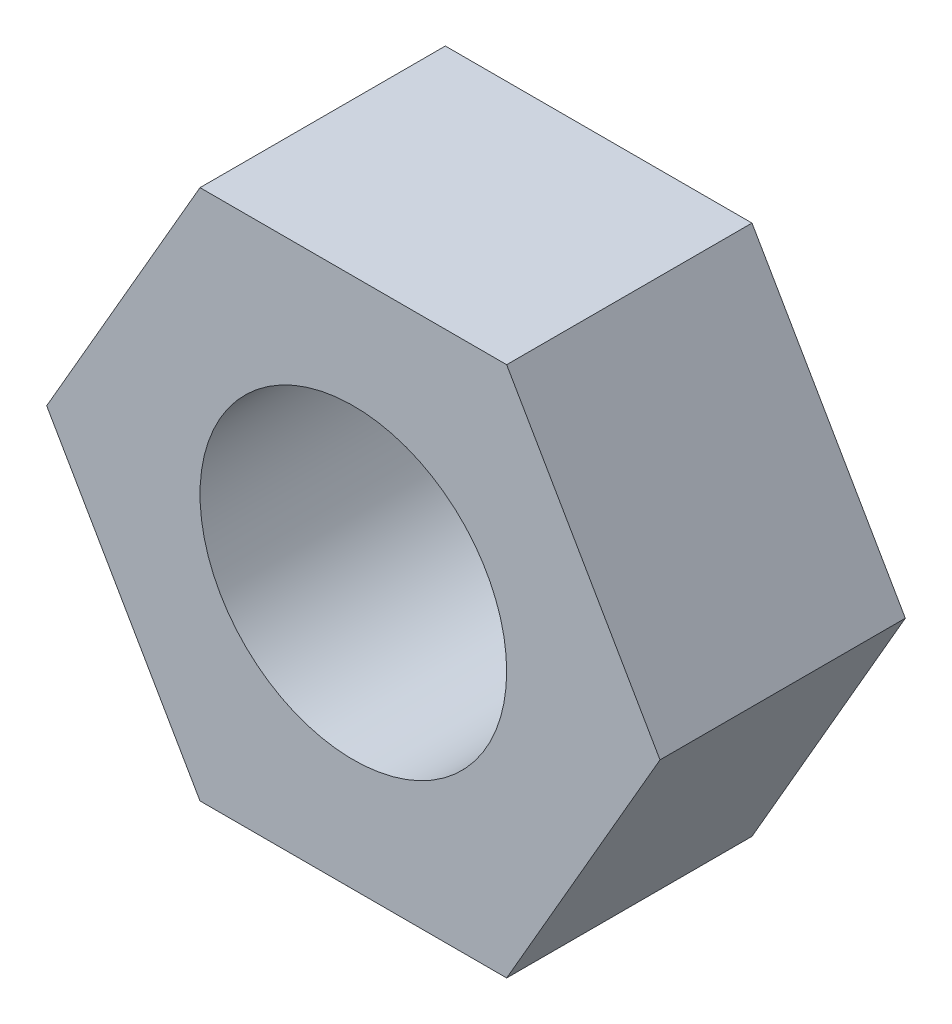
ISO-10303-21;
HEADER;
FILE_DESCRIPTION(('STEP AP214'),'2;1');
FILE_NAME('part.step','',(''),(''),'','','');
FILE_SCHEMA(('AUTOMOTIVE_DESIGN { 1 0 10303 214 1 1 1 1 }'));
ENDSEC;
DATA;
#1=APPLICATION_CONTEXT('core data for automotive mechanical design processes');
#2=APPLICATION_PROTOCOL_DEFINITION('international standard','automotive_design',2000,#1);
#3=PRODUCT_CONTEXT('',#1,'mechanical');
#4=PRODUCT('Part','Part','',(#3));
#5=PRODUCT_RELATED_PRODUCT_CATEGORY('part','',(#4));
#6=PRODUCT_DEFINITION_FORMATION('','',#4);
#7=PRODUCT_DEFINITION_CONTEXT('part definition',#1,'design');
#8=PRODUCT_DEFINITION('design','',#6,#7);
#9=PRODUCT_DEFINITION_SHAPE('','',#8);
#10=(LENGTH_UNIT() NAMED_UNIT(*) SI_UNIT(.MILLI.,.METRE.));
#11=(NAMED_UNIT(*) PLANE_ANGLE_UNIT() SI_UNIT($,.RADIAN.));
#12=(NAMED_UNIT(*) SI_UNIT($,.STERADIAN.) SOLID_ANGLE_UNIT());
#13=UNCERTAINTY_MEASURE_WITH_UNIT(LENGTH_MEASURE(1.E-05),#10,'distance_accuracy_value','');
#14=(GEOMETRIC_REPRESENTATION_CONTEXT(3) GLOBAL_UNCERTAINTY_ASSIGNED_CONTEXT((#13)) GLOBAL_UNIT_ASSIGNED_CONTEXT((#10,
#11,#12)) REPRESENTATION_CONTEXT('',''));
#15=CARTESIAN_POINT('',(0.,0.,0.));
#16=DIRECTION('',(0.,0.,1.));
#17=DIRECTION('',(1.,0.,0.));
#18=AXIS2_PLACEMENT_3D('',#15,#16,#17);
#19=CARTESIAN_POINT('',(2.50000000000005,-4.33012701892216,4.));
#20=DIRECTION('',(-0.866025403784442,0.499999999999995,0.));
#21=DIRECTION('',(-0.499999999999995,-0.866025403784442,0.));
#22=AXIS2_PLACEMENT_3D('',#19,#20,#21);
#23=PLANE('',#22);
#24=DIRECTION('',(0.499999999999995,0.866025403784442,0.));
#25=VECTOR('',#24,1.);
#26=CARTESIAN_POINT('',(2.50000000000005,-4.33012701892216,0.));
#27=LINE('',#26,#25);
#28=CARTESIAN_POINT('',(2.50000000000005,-4.33012701892216,0.));
#29=VERTEX_POINT('',#28);
#30=CARTESIAN_POINT('',(5.,0.,0.));
#31=VERTEX_POINT('',#30);
#32=EDGE_CURVE('E116',#29,#31,#27,.T.);
#33=ORIENTED_EDGE('',*,*,#32,.T.);
#34=DIRECTION('',(0.,0.,-1.));
#35=VECTOR('',#34,1.);
#36=CARTESIAN_POINT('',(5.,0.,4.));
#37=LINE('',#36,#35);
#38=CARTESIAN_POINT('',(5.,0.,4.));
#39=VERTEX_POINT('',#38);
#40=EDGE_CURVE('E11',#39,#31,#37,.T.);
#41=ORIENTED_EDGE('',*,*,#40,.F.);
#42=DIRECTION('',(0.499999999999995,0.866025403784442,0.));
#43=VECTOR('',#42,1.);
#44=CARTESIAN_POINT('',(2.50000000000005,-4.33012701892216,4.));
#45=LINE('',#44,#43);
#46=CARTESIAN_POINT('',(2.50000000000005,-4.33012701892216,4.));
#47=VERTEX_POINT('',#46);
#48=EDGE_CURVE('E127',#47,#39,#45,.T.);
#49=ORIENTED_EDGE('',*,*,#48,.F.);
#50=DIRECTION('',(0.,0.,-1.));
#51=VECTOR('',#50,1.);
#52=CARTESIAN_POINT('',(2.50000000000005,-4.33012701892216,4.));
#53=LINE('',#52,#51);
#54=EDGE_CURVE('E112',#47,#29,#53,.T.);
#55=ORIENTED_EDGE('',*,*,#54,.T.);
#56=EDGE_LOOP('',(#33,#41,#49,#55));
#57=FACE_BOUND('',#56,.T.);
#58=ADVANCED_FACE('F32',(#57),#23,.F.);
#59=CARTESIAN_POINT('',(5.,0.,4.));
#60=DIRECTION('',(-0.866025403784438,-0.500000000000001,0.));
#61=DIRECTION('',(0.500000000000001,-0.866025403784438,0.));
#62=AXIS2_PLACEMENT_3D('',#59,#60,#61);
#63=PLANE('',#62);
#64=DIRECTION('',(-0.500000000000001,0.866025403784438,0.));
#65=VECTOR('',#64,1.);
#66=CARTESIAN_POINT('',(5.,0.,0.));
#67=LINE('',#66,#65);
#68=CARTESIAN_POINT('',(2.49999999999999,4.3301270189222,0.));
#69=VERTEX_POINT('',#68);
#70=EDGE_CURVE('E119',#31,#69,#67,.T.);
#71=ORIENTED_EDGE('',*,*,#70,.T.);
#72=DIRECTION('',(0.,0.,-1.));
#73=VECTOR('',#72,1.);
#74=CARTESIAN_POINT('',(2.49999999999999,4.3301270189222,4.));
#75=LINE('',#74,#73);
#76=CARTESIAN_POINT('',(2.49999999999999,4.3301270189222,4.));
#77=VERTEX_POINT('',#76);
#78=EDGE_CURVE('E40',#77,#69,#75,.T.);
#79=ORIENTED_EDGE('',*,*,#78,.F.);
#80=DIRECTION('',(-0.500000000000001,0.866025403784438,0.));
#81=VECTOR('',#80,1.);
#82=CARTESIAN_POINT('',(5.,0.,4.));
#83=LINE('',#82,#81);
#84=EDGE_CURVE('E85',#39,#77,#83,.T.);
#85=ORIENTED_EDGE('',*,*,#84,.F.);
#86=ORIENTED_EDGE('',*,*,#40,.T.);
#87=EDGE_LOOP('',(#71,#79,#85,#86));
#88=FACE_BOUND('',#87,.T.);
#89=ADVANCED_FACE('F152',(#88),#63,.F.);
#90=CARTESIAN_POINT('',(2.49999999999999,4.3301270189222,4.));
#91=DIRECTION('',(0.,-1.,0.));
#92=DIRECTION('',(1.,0.,0.));
#93=AXIS2_PLACEMENT_3D('',#90,#91,#92);
#94=PLANE('',#93);
#95=DIRECTION('',(-1.,0.,0.));
#96=VECTOR('',#95,1.);
#97=CARTESIAN_POINT('',(2.49999999999999,4.3301270189222,0.));
#98=LINE('',#97,#96);
#99=CARTESIAN_POINT('',(-2.50000000000002,4.33012701892218,0.));
#100=VERTEX_POINT('',#99);
#101=EDGE_CURVE('E122',#69,#100,#98,.T.);
#102=ORIENTED_EDGE('',*,*,#101,.T.);
#103=DIRECTION('',(0.,0.,-1.));
#104=VECTOR('',#103,1.);
#105=CARTESIAN_POINT('',(-2.50000000000002,4.33012701892218,4.));
#106=LINE('',#105,#104);
#107=CARTESIAN_POINT('',(-2.50000000000002,4.33012701892218,4.));
#108=VERTEX_POINT('',#107);
#109=EDGE_CURVE('E107',#108,#100,#106,.T.);
#110=ORIENTED_EDGE('',*,*,#109,.F.);
#111=DIRECTION('',(-1.,0.,0.));
#112=VECTOR('',#111,1.);
#113=CARTESIAN_POINT('',(2.49999999999999,4.3301270189222,4.));
#114=LINE('',#113,#112);
#115=EDGE_CURVE('E98',#77,#108,#114,.T.);
#116=ORIENTED_EDGE('',*,*,#115,.F.);
#117=ORIENTED_EDGE('',*,*,#78,.T.);
#118=EDGE_LOOP('',(#102,#110,#116,#117));
#119=FACE_BOUND('',#118,.T.);
#120=ADVANCED_FACE('F133',(#119),#94,.F.);
#121=CARTESIAN_POINT('',(-2.50000000000002,4.33012701892218,4.));
#122=DIRECTION('',(0.866025403784441,-0.499999999999995,0.));
#123=DIRECTION('',(0.499999999999995,0.866025403784442,0.));
#124=AXIS2_PLACEMENT_3D('',#121,#122,#123);
#125=PLANE('',#124);
#126=DIRECTION('',(-0.499999999999995,-0.866025403784441,0.));
#127=VECTOR('',#126,1.);
#128=CARTESIAN_POINT('',(-2.50000000000002,4.33012701892218,0.));
#129=LINE('',#128,#127);
#130=CARTESIAN_POINT('',(-5.,0.,0.));
#131=VERTEX_POINT('',#130);
#132=EDGE_CURVE('E106',#100,#131,#129,.T.);
#133=ORIENTED_EDGE('',*,*,#132,.T.);
#134=DIRECTION('',(0.,0.,-1.));
#135=VECTOR('',#134,1.);
#136=CARTESIAN_POINT('',(-5.,0.,4.));
#137=LINE('',#136,#135);
#138=CARTESIAN_POINT('',(-5.,0.,4.));
#139=VERTEX_POINT('',#138);
#140=EDGE_CURVE('E103',#139,#131,#137,.T.);
#141=ORIENTED_EDGE('',*,*,#140,.F.);
#142=DIRECTION('',(-0.499999999999995,-0.866025403784441,0.));
#143=VECTOR('',#142,1.);
#144=CARTESIAN_POINT('',(-2.50000000000002,4.33012701892218,4.));
#145=LINE('',#144,#143);
#146=EDGE_CURVE('E92',#108,#139,#145,.T.);
#147=ORIENTED_EDGE('',*,*,#146,.F.);
#148=ORIENTED_EDGE('',*,*,#109,.T.);
#149=EDGE_LOOP('',(#133,#141,#147,#148));
#150=FACE_BOUND('',#149,.T.);
#151=ADVANCED_FACE('F104',(#150),#125,.F.);
#152=CARTESIAN_POINT('',(-5.,0.,4.));
#153=DIRECTION('',(0.866025403784434,0.500000000000007,0.));
#154=DIRECTION('',(-0.500000000000007,0.866025403784434,0.));
#155=AXIS2_PLACEMENT_3D('',#152,#153,#154);
#156=PLANE('',#155);
#157=DIRECTION('',(0.500000000000007,-0.866025403784434,0.));
#158=VECTOR('',#157,1.);
#159=CARTESIAN_POINT('',(-5.,0.,0.));
#160=LINE('',#159,#158);
#161=CARTESIAN_POINT('',(-2.49999999999996,-4.33012701892222,0.));
#162=VERTEX_POINT('',#161);
#163=EDGE_CURVE('E71',#131,#162,#160,.T.);
#164=ORIENTED_EDGE('',*,*,#163,.T.);
#165=DIRECTION('',(0.,0.,-1.));
#166=VECTOR('',#165,1.);
#167=CARTESIAN_POINT('',(-2.49999999999996,-4.33012701892222,4.));
#168=LINE('',#167,#166);
#169=CARTESIAN_POINT('',(-2.49999999999996,-4.33012701892222,4.));
#170=VERTEX_POINT('',#169);
#171=EDGE_CURVE('E108',#170,#162,#168,.T.);
#172=ORIENTED_EDGE('',*,*,#171,.F.);
#173=DIRECTION('',(0.500000000000007,-0.866025403784434,0.));
#174=VECTOR('',#173,1.);
#175=CARTESIAN_POINT('',(-5.,0.,4.));
#176=LINE('',#175,#174);
#177=EDGE_CURVE('E96',#139,#170,#176,.T.);
#178=ORIENTED_EDGE('',*,*,#177,.F.);
#179=ORIENTED_EDGE('',*,*,#140,.T.);
#180=EDGE_LOOP('',(#164,#172,#178,#179));
#181=FACE_BOUND('',#180,.T.);
#182=ADVANCED_FACE('F110',(#181),#156,.F.);
#183=CARTESIAN_POINT('',(-2.49999999999996,-4.33012701892222,4.));
#184=DIRECTION('',(0.,1.,0.));
#185=DIRECTION('',(-1.,0.,0.));
#186=AXIS2_PLACEMENT_3D('',#183,#184,#185);
#187=PLANE('',#186);
#188=DIRECTION('',(1.,0.,0.));
#189=VECTOR('',#188,1.);
#190=CARTESIAN_POINT('',(-2.49999999999996,-4.33012701892222,0.));
#191=LINE('',#190,#189);
#192=EDGE_CURVE('E77',#162,#29,#191,.T.);
#193=ORIENTED_EDGE('',*,*,#192,.T.);
#194=ORIENTED_EDGE('',*,*,#54,.F.);
#195=DIRECTION('',(1.,0.,0.));
#196=VECTOR('',#195,1.);
#197=CARTESIAN_POINT('',(-2.49999999999996,-4.33012701892222,4.));
#198=LINE('',#197,#196);
#199=EDGE_CURVE('E48',#170,#47,#198,.T.);
#200=ORIENTED_EDGE('',*,*,#199,.F.);
#201=ORIENTED_EDGE('',*,*,#171,.T.);
#202=EDGE_LOOP('',(#193,#194,#200,#201));
#203=FACE_BOUND('',#202,.T.);
#204=ADVANCED_FACE('F140',(#203),#187,.F.);
#205=CARTESIAN_POINT('',(0.,0.,4.));
#206=DIRECTION('',(0.,0.,1.));
#207=DIRECTION('',(1.,0.,0.));
#208=AXIS2_PLACEMENT_3D('',#205,#206,#207);
#209=PLANE('',#208);
#210=CARTESIAN_POINT('',(0.,0.,4.));
#211=DIRECTION('',(0.,0.,1.));
#212=DIRECTION('',(1.,0.,0.));
#213=AXIS2_PLACEMENT_3D('',#210,#211,#212);
#214=CIRCLE('',#213,2.5);
#215=CARTESIAN_POINT('',(2.5,0.,4.));
#216=VERTEX_POINT('',#215);
#217=EDGE_CURVE('E207',#216,#216,#214,.T.);
#218=ORIENTED_EDGE('',*,*,#217,.F.);
#219=EDGE_LOOP('',(#218));
#220=FACE_BOUND('',#219,.T.);
#221=ORIENTED_EDGE('',*,*,#48,.T.);
#222=ORIENTED_EDGE('',*,*,#84,.T.);
#223=ORIENTED_EDGE('',*,*,#115,.T.);
#224=ORIENTED_EDGE('',*,*,#146,.T.);
#225=ORIENTED_EDGE('',*,*,#177,.T.);
#226=ORIENTED_EDGE('',*,*,#199,.T.);
#227=EDGE_LOOP('',(#221,#222,#223,#224,#225,#226));
#228=FACE_BOUND('',#227,.T.);
#229=ADVANCED_FACE('F94',(#220,#228),#209,.T.);
#230=CARTESIAN_POINT('',(0.,0.,0.));
#231=DIRECTION('',(0.,0.,1.));
#232=DIRECTION('',(1.,0.,0.));
#233=AXIS2_PLACEMENT_3D('',#230,#231,#232);
#234=PLANE('',#233);
#235=CARTESIAN_POINT('',(0.,0.,0.));
#236=DIRECTION('',(0.,0.,1.));
#237=DIRECTION('',(1.,0.,0.));
#238=AXIS2_PLACEMENT_3D('',#235,#236,#237);
#239=CIRCLE('',#238,2.5);
#240=CARTESIAN_POINT('',(2.5,0.,0.));
#241=VERTEX_POINT('',#240);
#242=EDGE_CURVE('E120',#241,#241,#239,.T.);
#243=ORIENTED_EDGE('',*,*,#242,.T.);
#244=EDGE_LOOP('',(#243));
#245=FACE_BOUND('',#244,.T.);
#246=ORIENTED_EDGE('',*,*,#32,.F.);
#247=ORIENTED_EDGE('',*,*,#192,.F.);
#248=ORIENTED_EDGE('',*,*,#163,.F.);
#249=ORIENTED_EDGE('',*,*,#132,.F.);
#250=ORIENTED_EDGE('',*,*,#101,.F.);
#251=ORIENTED_EDGE('',*,*,#70,.F.);
#252=EDGE_LOOP('',(#246,#247,#248,#249,#250,#251));
#253=FACE_BOUND('',#252,.T.);
#254=ADVANCED_FACE('F136',(#245,#253),#234,.F.);
#255=CARTESIAN_POINT('',(0.,0.,0.));
#256=DIRECTION('',(0.,0.,1.));
#257=DIRECTION('',(1.,0.,0.));
#258=AXIS2_PLACEMENT_3D('',#255,#256,#257);
#259=CYLINDRICAL_SURFACE('',#258,2.5);
#260=ORIENTED_EDGE('',*,*,#242,.F.);
#261=EDGE_LOOP('',(#260));
#262=FACE_BOUND('',#261,.T.);
#263=ORIENTED_EDGE('',*,*,#217,.T.);
#264=EDGE_LOOP('',(#263));
#265=FACE_BOUND('',#264,.T.);
#266=ADVANCED_FACE('F189',(#262,#265),#259,.F.);
#267=CLOSED_SHELL('',(#58,#89,#120,#151,#182,#204,#229,#254,#266));
#268=MANIFOLD_SOLID_BREP('B2',#267);
#269=ADVANCED_BREP_SHAPE_REPRESENTATION('',(#18,#268),#14);
#270=SHAPE_DEFINITION_REPRESENTATION(#9,#269);
ENDSEC;
END-ISO-10303-21;
